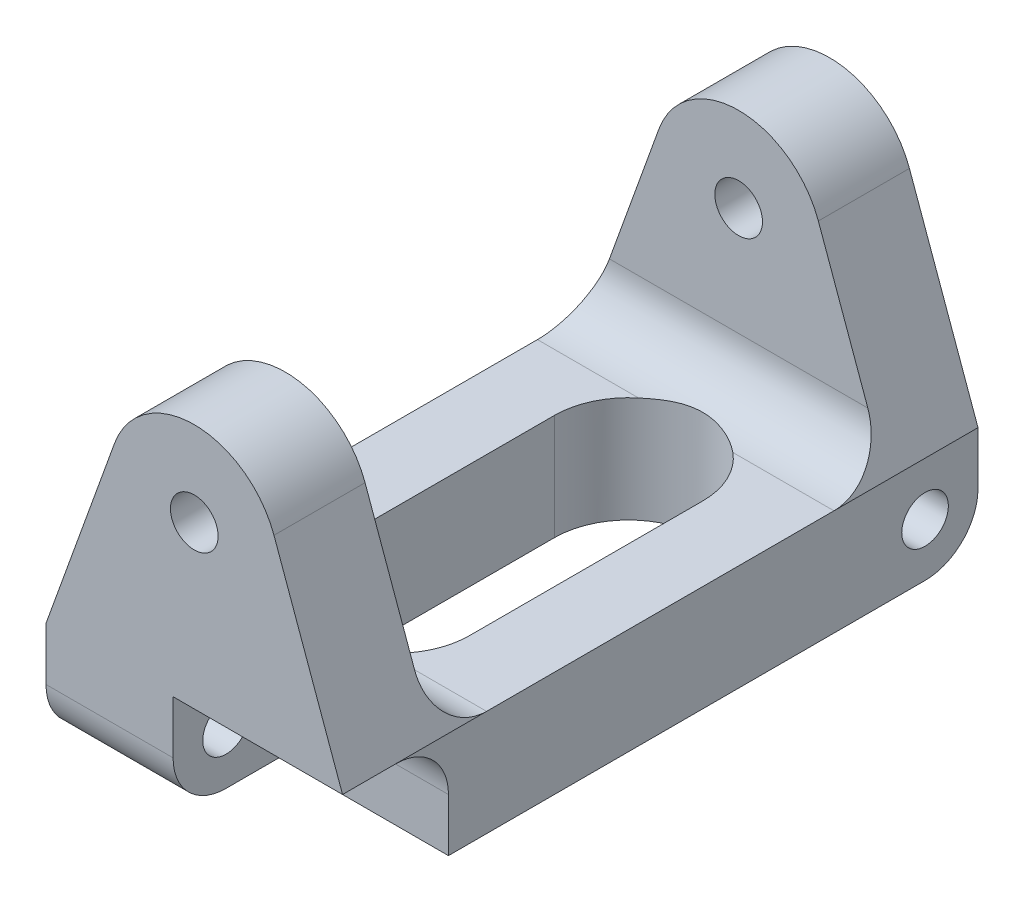
ISO-10303-21;
HEADER;
FILE_DESCRIPTION(('STEP AP214'),'2;1');
FILE_NAME('part.step','',(''),(''),'','','');
FILE_SCHEMA(('AUTOMOTIVE_DESIGN { 1 0 10303 214 1 1 1 1 }'));
ENDSEC;
DATA;
#1=APPLICATION_CONTEXT('core data for automotive mechanical design processes');
#2=APPLICATION_PROTOCOL_DEFINITION('international standard','automotive_design',2000,#1);
#3=PRODUCT_CONTEXT('',#1,'mechanical');
#4=PRODUCT('Part','Part','',(#3));
#5=PRODUCT_RELATED_PRODUCT_CATEGORY('part','',(#4));
#6=PRODUCT_DEFINITION_FORMATION('','',#4);
#7=PRODUCT_DEFINITION_CONTEXT('part definition',#1,'design');
#8=PRODUCT_DEFINITION('design','',#6,#7);
#9=PRODUCT_DEFINITION_SHAPE('','',#8);
#10=(LENGTH_UNIT() NAMED_UNIT(*) SI_UNIT(.MILLI.,.METRE.));
#11=(NAMED_UNIT(*) PLANE_ANGLE_UNIT() SI_UNIT($,.RADIAN.));
#12=(NAMED_UNIT(*) SI_UNIT($,.STERADIAN.) SOLID_ANGLE_UNIT());
#13=UNCERTAINTY_MEASURE_WITH_UNIT(LENGTH_MEASURE(1.E-05),#10,'distance_accuracy_value','');
#14=(GEOMETRIC_REPRESENTATION_CONTEXT(3) GLOBAL_UNCERTAINTY_ASSIGNED_CONTEXT((#13)) GLOBAL_UNIT_ASSIGNED_CONTEXT((#10,
#11,#12)) REPRESENTATION_CONTEXT('',''));
#15=CARTESIAN_POINT('',(0.,0.,0.));
#16=DIRECTION('',(0.,0.,1.));
#17=DIRECTION('',(1.,0.,0.));
#18=AXIS2_PLACEMENT_3D('',#15,#16,#17);
#19=CARTESIAN_POINT('',(10.1112698372208,-2.5,12.5));
#20=DIRECTION('',(-1.,0.,0.));
#21=DIRECTION('',(0.,0.,-1.));
#22=AXIS2_PLACEMENT_3D('',#19,#20,#21);
#23=CYLINDRICAL_SURFACE('',#22,1.1);
#24=CARTESIAN_POINT('',(-7.,-2.5,12.5));
#25=DIRECTION('',(1.,0.,0.));
#26=DIRECTION('',(0.,0.,-1.));
#27=AXIS2_PLACEMENT_3D('',#24,#25,#26);
#28=CIRCLE('',#27,1.1);
#29=CARTESIAN_POINT('',(-7.,-2.5,11.4));
#30=VERTEX_POINT('',#29);
#31=EDGE_CURVE('E370',#30,#30,#28,.T.);
#32=ORIENTED_EDGE('',*,*,#31,.F.);
#33=EDGE_LOOP('',(#32));
#34=FACE_BOUND('',#33,.T.);
#35=CARTESIAN_POINT('',(-0.999999999999996,-2.5,12.5));
#36=DIRECTION('',(1.,0.,0.));
#37=DIRECTION('',(0.,0.,-1.));
#38=AXIS2_PLACEMENT_3D('',#35,#36,#37);
#39=CIRCLE('',#38,1.1);
#40=CARTESIAN_POINT('',(-0.999999999999996,-2.5,11.4));
#41=VERTEX_POINT('',#40);
#42=EDGE_CURVE('E450',#41,#41,#39,.T.);
#43=ORIENTED_EDGE('',*,*,#42,.T.);
#44=EDGE_LOOP('',(#43));
#45=FACE_BOUND('',#44,.T.);
#46=ADVANCED_FACE('F56',(#34,#45),#23,.F.);
#47=CARTESIAN_POINT('',(0.,-2.5,12.5));
#48=DIRECTION('',(1.,0.,0.));
#49=DIRECTION('',(0.,0.,1.));
#50=AXIS2_PLACEMENT_3D('',#47,#48,#49);
#51=CYLINDRICAL_SURFACE('',#50,2.5);
#52=DIRECTION('',(1.,0.,0.));
#53=VECTOR('',#52,1.);
#54=CARTESIAN_POINT('',(0.,-5.,12.5));
#55=LINE('',#54,#53);
#56=CARTESIAN_POINT('',(-7.,-5.,12.5));
#57=VERTEX_POINT('',#56);
#58=CARTESIAN_POINT('',(-0.999999999999996,-5.,12.5));
#59=VERTEX_POINT('',#58);
#60=EDGE_CURVE('E228',#57,#59,#55,.T.);
#61=ORIENTED_EDGE('',*,*,#60,.T.);
#62=CARTESIAN_POINT('',(-0.999999999999996,-2.5,12.5));
#63=DIRECTION('',(1.,0.,0.));
#64=DIRECTION('',(0.,0.,-1.));
#65=AXIS2_PLACEMENT_3D('',#62,#63,#64);
#66=CIRCLE('',#65,2.5);
#67=CARTESIAN_POINT('',(-0.999999999999996,-2.5,15.));
#68=VERTEX_POINT('',#67);
#69=EDGE_CURVE('E213',#68,#59,#66,.T.);
#70=ORIENTED_EDGE('',*,*,#69,.F.);
#71=DIRECTION('',(1.,0.,0.));
#72=VECTOR('',#71,1.);
#73=CARTESIAN_POINT('',(0.,-2.5,15.));
#74=LINE('',#73,#72);
#75=CARTESIAN_POINT('',(-7.,-2.5,15.));
#76=VERTEX_POINT('',#75);
#77=EDGE_CURVE('E236',#68,#76,#74,.F.);
#78=ORIENTED_EDGE('',*,*,#77,.T.);
#79=CARTESIAN_POINT('',(-7.,-2.5,12.5));
#80=DIRECTION('',(-1.,0.,0.));
#81=DIRECTION('',(0.,0.,1.));
#82=AXIS2_PLACEMENT_3D('',#79,#80,#81);
#83=CIRCLE('',#82,2.5);
#84=EDGE_CURVE('E235',#76,#57,#83,.F.);
#85=ORIENTED_EDGE('',*,*,#84,.T.);
#86=EDGE_LOOP('',(#61,#70,#78,#85));
#87=FACE_BOUND('',#86,.T.);
#88=ADVANCED_FACE('F233',(#87),#51,.T.);
#89=CARTESIAN_POINT('',(0.,0.,0.));
#90=DIRECTION('',(0.,1.,0.));
#91=DIRECTION('',(0.,0.,1.));
#92=AXIS2_PLACEMENT_3D('',#89,#90,#91);
#93=PLANE('',#92);
#94=DIRECTION('',(0.,0.,1.));
#95=VECTOR('',#94,1.);
#96=CARTESIAN_POINT('',(-3.5,0.,5.5));
#97=LINE('',#96,#95);
#98=CARTESIAN_POINT('',(-3.5,0.,-5.5));
#99=VERTEX_POINT('',#98);
#100=CARTESIAN_POINT('',(-3.5,0.,5.5));
#101=VERTEX_POINT('',#100);
#102=EDGE_CURVE('E583',#99,#101,#97,.T.);
#103=ORIENTED_EDGE('',*,*,#102,.F.);
#104=CARTESIAN_POINT('',(0.,0.,-5.5));
#105=DIRECTION('',(0.,1.,0.));
#106=DIRECTION('',(0.,0.,1.));
#107=AXIS2_PLACEMENT_3D('',#104,#105,#106);
#108=CIRCLE('',#107,3.5);
#109=CARTESIAN_POINT('',(-2.22710574513201,0.,-8.2));
#110=VERTEX_POINT('',#109);
#111=EDGE_CURVE('E582',#110,#99,#108,.T.);
#112=ORIENTED_EDGE('',*,*,#111,.F.);
#113=DIRECTION('',(-1.,0.,0.));
#114=VECTOR('',#113,1.);
#115=CARTESIAN_POINT('',(-7.,0.,-8.2));
#116=LINE('',#115,#114);
#117=CARTESIAN_POINT('',(-7.,0.,-8.19999999999998));
#118=VERTEX_POINT('',#117);
#119=EDGE_CURVE('E497',#110,#118,#116,.T.);
#120=ORIENTED_EDGE('',*,*,#119,.T.);
#121=DIRECTION('',(0.,0.,-1.));
#122=VECTOR('',#121,1.);
#123=CARTESIAN_POINT('',(-7.,0.,0.));
#124=LINE('',#123,#122);
#125=CARTESIAN_POINT('',(-7.,0.,8.19999999999998));
#126=VERTEX_POINT('',#125);
#127=EDGE_CURVE('E482',#126,#118,#124,.T.);
#128=ORIENTED_EDGE('',*,*,#127,.F.);
#129=DIRECTION('',(-1.,0.,0.));
#130=VECTOR('',#129,1.);
#131=CARTESIAN_POINT('',(-7.,0.,8.2));
#132=LINE('',#131,#130);
#133=CARTESIAN_POINT('',(-2.22710574513201,0.,8.2));
#134=VERTEX_POINT('',#133);
#135=EDGE_CURVE('E360',#134,#126,#132,.T.);
#136=ORIENTED_EDGE('',*,*,#135,.F.);
#137=CARTESIAN_POINT('',(0.,0.,5.5));
#138=DIRECTION('',(0.,-1.,0.));
#139=DIRECTION('',(0.,0.,-1.));
#140=AXIS2_PLACEMENT_3D('',#137,#138,#139);
#141=CIRCLE('',#140,3.5);
#142=EDGE_CURVE('E419',#134,#101,#141,.T.);
#143=ORIENTED_EDGE('',*,*,#142,.T.);
#144=EDGE_LOOP('',(#103,#112,#120,#128,#136,#143));
#145=FACE_BOUND('',#144,.T.);
#146=ADVANCED_FACE('F310',(#145),#93,.T.);
#147=CARTESIAN_POINT('',(3.5,0.,-5.5));
#148=VERTEX_POINT('',#147);
#149=CARTESIAN_POINT('',(2.22710574513201,0.,-8.2));
#150=VERTEX_POINT('',#149);
#151=EDGE_CURVE('E79',#148,#150,#108,.T.);
#152=ORIENTED_EDGE('',*,*,#151,.F.);
#153=DIRECTION('',(0.,0.,-1.));
#154=VECTOR('',#153,1.);
#155=CARTESIAN_POINT('',(3.5,0.,5.5));
#156=LINE('',#155,#154);
#157=CARTESIAN_POINT('',(3.5,0.,5.5));
#158=VERTEX_POINT('',#157);
#159=EDGE_CURVE('E258',#158,#148,#156,.T.);
#160=ORIENTED_EDGE('',*,*,#159,.F.);
#161=CARTESIAN_POINT('',(2.22710574513201,0.,8.2));
#162=VERTEX_POINT('',#161);
#163=EDGE_CURVE('E414',#158,#162,#141,.T.);
#164=ORIENTED_EDGE('',*,*,#163,.T.);
#165=CARTESIAN_POINT('',(7.,0.,8.2));
#166=VERTEX_POINT('',#165);
#167=EDGE_CURVE('E241',#166,#162,#132,.T.);
#168=ORIENTED_EDGE('',*,*,#167,.F.);
#169=DIRECTION('',(0.,0.,-1.));
#170=VECTOR('',#169,1.);
#171=CARTESIAN_POINT('',(7.,0.,0.));
#172=LINE('',#171,#170);
#173=CARTESIAN_POINT('',(7.,0.,-8.2));
#174=VERTEX_POINT('',#173);
#175=EDGE_CURVE('E487',#166,#174,#172,.T.);
#176=ORIENTED_EDGE('',*,*,#175,.T.);
#177=EDGE_CURVE('E499',#174,#150,#116,.T.);
#178=ORIENTED_EDGE('',*,*,#177,.T.);
#179=EDGE_LOOP('',(#152,#160,#164,#168,#176,#178));
#180=FACE_BOUND('',#179,.T.);
#181=ADVANCED_FACE('F306',(#180),#93,.T.);
#182=CARTESIAN_POINT('',(-7.,-5.,0.));
#183=DIRECTION('',(1.,0.,0.));
#184=DIRECTION('',(0.,0.,-1.));
#185=AXIS2_PLACEMENT_3D('',#182,#183,#184);
#186=PLANE('',#185);
#187=CARTESIAN_POINT('',(-7.,-2.5,-12.5));
#188=DIRECTION('',(-1.,0.,0.));
#189=DIRECTION('',(0.,0.,1.));
#190=AXIS2_PLACEMENT_3D('',#187,#188,#189);
#191=CIRCLE('',#190,1.1);
#192=CARTESIAN_POINT('',(-7.,-2.5,-11.4));
#193=VERTEX_POINT('',#192);
#194=EDGE_CURVE('E567',#193,#193,#191,.T.);
#195=ORIENTED_EDGE('',*,*,#194,.F.);
#196=EDGE_LOOP('',(#195));
#197=FACE_BOUND('',#196,.T.);
#198=DIRECTION('',(0.,1.,0.));
#199=VECTOR('',#198,1.);
#200=CARTESIAN_POINT('',(-7.,-5.,-15.));
#201=LINE('',#200,#199);
#202=CARTESIAN_POINT('',(-7.,-2.5,-15.));
#203=VERTEX_POINT('',#202);
#204=CARTESIAN_POINT('',(-7.,0.,-15.));
#205=VERTEX_POINT('',#204);
#206=EDGE_CURVE('E495',#203,#205,#201,.T.);
#207=ORIENTED_EDGE('',*,*,#206,.F.);
#208=CARTESIAN_POINT('',(-7.,-2.5,-12.5));
#209=DIRECTION('',(1.,0.,0.));
#210=DIRECTION('',(0.,0.,-1.));
#211=AXIS2_PLACEMENT_3D('',#208,#209,#210);
#212=CIRCLE('',#211,2.5);
#213=CARTESIAN_POINT('',(-7.,-5.,-12.5));
#214=VERTEX_POINT('',#213);
#215=EDGE_CURVE('E509',#203,#214,#212,.F.);
#216=ORIENTED_EDGE('',*,*,#215,.T.);
#217=DIRECTION('',(0.,0.,-1.));
#218=VECTOR('',#217,1.);
#219=CARTESIAN_POINT('',(-7.,-5.,0.));
#220=LINE('',#219,#218);
#221=EDGE_CURVE('E481',#57,#214,#220,.T.);
#222=ORIENTED_EDGE('',*,*,#221,.F.);
#223=ORIENTED_EDGE('',*,*,#84,.F.);
#224=DIRECTION('',(0.,1.,0.));
#225=VECTOR('',#224,1.);
#226=CARTESIAN_POINT('',(-7.,-5.,15.));
#227=LINE('',#226,#225);
#228=CARTESIAN_POINT('',(-7.,0.,15.));
#229=VERTEX_POINT('',#228);
#230=EDGE_CURVE('E368',#76,#229,#227,.T.);
#231=ORIENTED_EDGE('',*,*,#230,.T.);
#232=DIRECTION('',(0.,0.,1.));
#233=VECTOR('',#232,1.);
#234=CARTESIAN_POINT('',(-7.,0.,-7.49726971278934));
#235=LINE('',#234,#233);
#236=EDGE_CURVE('E375',#126,#229,#235,.T.);
#237=ORIENTED_EDGE('',*,*,#236,.F.);
#238=ORIENTED_EDGE('',*,*,#127,.T.);
#239=DIRECTION('',(0.,0.,-1.));
#240=VECTOR('',#239,1.);
#241=CARTESIAN_POINT('',(-7.,0.,7.49726971278934));
#242=LINE('',#241,#240);
#243=EDGE_CURVE('E563',#118,#205,#242,.T.);
#244=ORIENTED_EDGE('',*,*,#243,.T.);
#245=EDGE_LOOP('',(#207,#216,#222,#223,#231,#237,#238,#244));
#246=FACE_BOUND('',#245,.T.);
#247=ORIENTED_EDGE('',*,*,#31,.T.);
#248=EDGE_LOOP('',(#247));
#249=FACE_BOUND('',#248,.T.);
#250=ADVANCED_FACE('F309',(#197,#246,#249),#186,.F.);
#251=CARTESIAN_POINT('',(0.,-5.,-15.));
#252=DIRECTION('',(0.,0.,1.));
#253=DIRECTION('',(1.,0.,0.));
#254=AXIS2_PLACEMENT_3D('',#251,#252,#253);
#255=PLANE('',#254);
#256=CARTESIAN_POINT('',(0.,7.625,-15.));
#257=DIRECTION('',(0.,0.,-1.));
#258=DIRECTION('',(-1.,0.,0.));
#259=AXIS2_PLACEMENT_3D('',#256,#257,#258);
#260=CIRCLE('',#259,1.125);
#261=CARTESIAN_POINT('',(-1.125,7.625,-15.));
#262=VERTEX_POINT('',#261);
#263=EDGE_CURVE('E594',#262,#262,#260,.T.);
#264=ORIENTED_EDGE('',*,*,#263,.F.);
#265=EDGE_LOOP('',(#264));
#266=FACE_BOUND('',#265,.T.);
#267=DIRECTION('',(0.,1.,0.));
#268=VECTOR('',#267,1.);
#269=CARTESIAN_POINT('',(7.,-5.,-15.));
#270=LINE('',#269,#268);
#271=CARTESIAN_POINT('',(7.,-2.5,-15.));
#272=VERTEX_POINT('',#271);
#273=CARTESIAN_POINT('',(7.,0.,-15.));
#274=VERTEX_POINT('',#273);
#275=EDGE_CURVE('E484',#272,#274,#270,.T.);
#276=ORIENTED_EDGE('',*,*,#275,.F.);
#277=DIRECTION('',(1.,0.,0.));
#278=VECTOR('',#277,1.);
#279=CARTESIAN_POINT('',(0.,-2.5,-15.));
#280=LINE('',#279,#278);
#281=EDGE_CURVE('E507',#272,#203,#280,.F.);
#282=ORIENTED_EDGE('',*,*,#281,.T.);
#283=ORIENTED_EDGE('',*,*,#206,.T.);
#284=DIRECTION('',(0.339062045334858,0.940764013668328,0.));
#285=VECTOR('',#284,1.);
#286=CARTESIAN_POINT('',(-7.,0.,-15.));
#287=LINE('',#286,#285);
#288=CARTESIAN_POINT('',(-3.76305605467331,8.98124818133944,-15.));
#289=VERTEX_POINT('',#288);
#290=EDGE_CURVE('E550',#205,#289,#287,.T.);
#291=ORIENTED_EDGE('',*,*,#290,.T.);
#292=CARTESIAN_POINT('',(0.,7.625,-15.));
#293=DIRECTION('',(0.,0.,-1.));
#294=DIRECTION('',(-1.,0.,0.));
#295=AXIS2_PLACEMENT_3D('',#292,#293,#294);
#296=CIRCLE('',#295,4.);
#297=CARTESIAN_POINT('',(3.76305605467331,8.98124818133944,-15.));
#298=VERTEX_POINT('',#297);
#299=EDGE_CURVE('E545',#289,#298,#296,.T.);
#300=ORIENTED_EDGE('',*,*,#299,.T.);
#301=DIRECTION('',(0.339062045334859,-0.940764013668328,0.));
#302=VECTOR('',#301,1.);
#303=CARTESIAN_POINT('',(7.,0.,-15.));
#304=LINE('',#303,#302);
#305=EDGE_CURVE('E542',#298,#274,#304,.T.);
#306=ORIENTED_EDGE('',*,*,#305,.T.);
#307=EDGE_LOOP('',(#276,#282,#283,#291,#300,#306));
#308=FACE_BOUND('',#307,.T.);
#309=ADVANCED_FACE('F314',(#266,#308),#255,.F.);
#310=CARTESIAN_POINT('',(7.,-5.,0.));
#311=DIRECTION('',(1.,0.,0.));
#312=DIRECTION('',(0.,0.,-1.));
#313=AXIS2_PLACEMENT_3D('',#310,#311,#312);
#314=PLANE('',#313);
#315=CARTESIAN_POINT('',(7.,-2.5,12.5));
#316=DIRECTION('',(1.,0.,0.));
#317=DIRECTION('',(0.,0.,-1.));
#318=AXIS2_PLACEMENT_3D('',#315,#316,#317);
#319=CIRCLE('',#318,2.5);
#320=CARTESIAN_POINT('',(7.,-2.5,10.));
#321=VERTEX_POINT('',#320);
#322=CARTESIAN_POINT('',(7.,0.,12.5));
#323=VERTEX_POINT('',#322);
#324=EDGE_CURVE('E454',#321,#323,#319,.T.);
#325=ORIENTED_EDGE('',*,*,#324,.F.);
#326=DIRECTION('',(0.,1.,0.));
#327=VECTOR('',#326,1.);
#328=CARTESIAN_POINT('',(7.,-5.,10.));
#329=LINE('',#328,#327);
#330=CARTESIAN_POINT('',(7.,-5.,10.));
#331=VERTEX_POINT('',#330);
#332=EDGE_CURVE('E451',#331,#321,#329,.T.);
#333=ORIENTED_EDGE('',*,*,#332,.F.);
#334=DIRECTION('',(0.,0.,-1.));
#335=VECTOR('',#334,1.);
#336=CARTESIAN_POINT('',(7.,-5.,0.));
#337=LINE('',#336,#335);
#338=CARTESIAN_POINT('',(7.,-5.,-12.5));
#339=VERTEX_POINT('',#338);
#340=EDGE_CURVE('E476',#331,#339,#337,.T.);
#341=ORIENTED_EDGE('',*,*,#340,.T.);
#342=CARTESIAN_POINT('',(7.,-2.5,-12.5));
#343=DIRECTION('',(1.,0.,0.));
#344=DIRECTION('',(0.,0.,-1.));
#345=AXIS2_PLACEMENT_3D('',#342,#343,#344);
#346=CIRCLE('',#345,2.5);
#347=EDGE_CURVE('E505',#339,#272,#346,.T.);
#348=ORIENTED_EDGE('',*,*,#347,.T.);
#349=ORIENTED_EDGE('',*,*,#275,.T.);
#350=DIRECTION('',(0.,0.,-1.));
#351=VECTOR('',#350,1.);
#352=CARTESIAN_POINT('',(7.,0.,7.49726971278934));
#353=LINE('',#352,#351);
#354=EDGE_CURVE('E519',#174,#274,#353,.T.);
#355=ORIENTED_EDGE('',*,*,#354,.F.);
#356=ORIENTED_EDGE('',*,*,#175,.F.);
#357=DIRECTION('',(0.,0.,1.));
#358=VECTOR('',#357,1.);
#359=CARTESIAN_POINT('',(7.,0.,-7.49726971278934));
#360=LINE('',#359,#358);
#361=EDGE_CURVE('E378',#166,#323,#360,.T.);
#362=ORIENTED_EDGE('',*,*,#361,.T.);
#363=EDGE_LOOP('',(#325,#333,#341,#348,#349,#355,#356,#362));
#364=FACE_BOUND('',#363,.T.);
#365=CARTESIAN_POINT('',(7.,-2.5,-12.5));
#366=DIRECTION('',(1.,0.,0.));
#367=DIRECTION('',(0.,0.,-1.));
#368=AXIS2_PLACEMENT_3D('',#365,#366,#367);
#369=CIRCLE('',#368,1.1);
#370=CARTESIAN_POINT('',(7.,-2.5,-13.6));
#371=VERTEX_POINT('',#370);
#372=EDGE_CURVE('E490',#371,#371,#369,.F.);
#373=ORIENTED_EDGE('',*,*,#372,.T.);
#374=EDGE_LOOP('',(#373));
#375=FACE_BOUND('',#374,.T.);
#376=ADVANCED_FACE('F304',(#364,#375),#314,.T.);
#377=CARTESIAN_POINT('',(0.,-5.,0.));
#378=DIRECTION('',(0.,1.,0.));
#379=DIRECTION('',(0.,0.,1.));
#380=AXIS2_PLACEMENT_3D('',#377,#378,#379);
#381=PLANE('',#380);
#382=DIRECTION('',(0.,0.,1.));
#383=VECTOR('',#382,1.);
#384=CARTESIAN_POINT('',(-3.5,-5.,0.));
#385=LINE('',#384,#383);
#386=CARTESIAN_POINT('',(-3.5,-5.,-5.5));
#387=VERTEX_POINT('',#386);
#388=CARTESIAN_POINT('',(-3.5,-5.,5.5));
#389=VERTEX_POINT('',#388);
#390=EDGE_CURVE('E12',#387,#389,#385,.T.);
#391=ORIENTED_EDGE('',*,*,#390,.T.);
#392=CARTESIAN_POINT('',(0.,-5.,5.5));
#393=DIRECTION('',(0.,-1.,0.));
#394=DIRECTION('',(0.,0.,-1.));
#395=AXIS2_PLACEMENT_3D('',#392,#393,#394);
#396=CIRCLE('',#395,3.5);
#397=CARTESIAN_POINT('',(3.5,-5.,5.5));
#398=VERTEX_POINT('',#397);
#399=EDGE_CURVE('E409',#389,#398,#396,.F.);
#400=ORIENTED_EDGE('',*,*,#399,.T.);
#401=DIRECTION('',(0.,0.,1.));
#402=VECTOR('',#401,1.);
#403=CARTESIAN_POINT('',(3.5,-5.,5.5));
#404=LINE('',#403,#402);
#405=CARTESIAN_POINT('',(3.5,-5.,-5.5));
#406=VERTEX_POINT('',#405);
#407=EDGE_CURVE('E593',#406,#398,#404,.T.);
#408=ORIENTED_EDGE('',*,*,#407,.F.);
#409=CARTESIAN_POINT('',(0.,-5.,-5.5));
#410=DIRECTION('',(0.,1.,0.));
#411=DIRECTION('',(0.,0.,1.));
#412=AXIS2_PLACEMENT_3D('',#409,#410,#411);
#413=CIRCLE('',#412,3.5);
#414=EDGE_CURVE('E259',#387,#406,#413,.F.);
#415=ORIENTED_EDGE('',*,*,#414,.F.);
#416=EDGE_LOOP('',(#391,#400,#408,#415));
#417=FACE_BOUND('',#416,.T.);
#418=ORIENTED_EDGE('',*,*,#340,.F.);
#419=DIRECTION('',(1.,0.,0.));
#420=VECTOR('',#419,1.);
#421=CARTESIAN_POINT('',(-0.999999999999996,-5.,10.));
#422=LINE('',#421,#420);
#423=CARTESIAN_POINT('',(-0.999999999999996,-5.,10.));
#424=VERTEX_POINT('',#423);
#425=EDGE_CURVE('E230',#424,#331,#422,.T.);
#426=ORIENTED_EDGE('',*,*,#425,.F.);
#427=DIRECTION('',(0.,0.,-1.));
#428=VECTOR('',#427,1.);
#429=CARTESIAN_POINT('',(-0.999999999999996,-5.,0.));
#430=LINE('',#429,#428);
#431=EDGE_CURVE('E217',#59,#424,#430,.T.);
#432=ORIENTED_EDGE('',*,*,#431,.F.);
#433=ORIENTED_EDGE('',*,*,#60,.F.);
#434=ORIENTED_EDGE('',*,*,#221,.T.);
#435=DIRECTION('',(1.,0.,0.));
#436=VECTOR('',#435,1.);
#437=CARTESIAN_POINT('',(0.,-5.,-12.5));
#438=LINE('',#437,#436);
#439=EDGE_CURVE('E480',#214,#339,#438,.T.);
#440=ORIENTED_EDGE('',*,*,#439,.T.);
#441=EDGE_LOOP('',(#418,#426,#432,#433,#434,#440));
#442=FACE_BOUND('',#441,.T.);
#443=ADVANCED_FACE('F226',(#417,#442),#381,.F.);
#444=CARTESIAN_POINT('',(10.1112698372208,-2.5,-12.5));
#445=DIRECTION('',(-1.,0.,0.));
#446=DIRECTION('',(0.,0.,1.));
#447=AXIS2_PLACEMENT_3D('',#444,#445,#446);
#448=CYLINDRICAL_SURFACE('',#447,1.1);
#449=ORIENTED_EDGE('',*,*,#194,.T.);
#450=EDGE_LOOP('',(#449));
#451=FACE_BOUND('',#450,.T.);
#452=ORIENTED_EDGE('',*,*,#372,.F.);
#453=EDGE_LOOP('',(#452));
#454=FACE_BOUND('',#453,.T.);
#455=ADVANCED_FACE('F297',(#451,#454),#448,.F.);
#456=CARTESIAN_POINT('',(0.,0.,-10.7));
#457=DIRECTION('',(0.,0.,1.));
#458=DIRECTION('',(1.,0.,0.));
#459=AXIS2_PLACEMENT_3D('',#456,#457,#458);
#460=PLANE('',#459);
#461=CARTESIAN_POINT('',(0.,7.625,-10.7));
#462=DIRECTION('',(0.,0.,1.));
#463=DIRECTION('',(1.,0.,0.));
#464=AXIS2_PLACEMENT_3D('',#461,#462,#463);
#465=CIRCLE('',#464,1.125);
#466=CARTESIAN_POINT('',(1.125,7.625,-10.7));
#467=VERTEX_POINT('',#466);
#468=EDGE_CURVE('E553',#467,#467,#465,.F.);
#469=ORIENTED_EDGE('',*,*,#468,.T.);
#470=EDGE_LOOP('',(#469));
#471=FACE_BOUND('',#470,.T.);
#472=DIRECTION('',(0.339062045334858,0.940764013668328,0.));
#473=VECTOR('',#472,1.);
#474=CARTESIAN_POINT('',(-7.,0.,-10.7));
#475=LINE('',#474,#473);
#476=CARTESIAN_POINT('',(-6.09897157945925,2.5,-10.7));
#477=VERTEX_POINT('',#476);
#478=CARTESIAN_POINT('',(-3.76305605467331,8.98124818133944,-10.7));
#479=VERTEX_POINT('',#478);
#480=EDGE_CURVE('E546',#477,#479,#475,.T.);
#481=ORIENTED_EDGE('',*,*,#480,.F.);
#482=DIRECTION('',(-1.,0.,0.));
#483=VECTOR('',#482,1.);
#484=CARTESIAN_POINT('',(7.,2.5,-10.7));
#485=LINE('',#484,#483);
#486=CARTESIAN_POINT('',(6.09897157945926,2.5,-10.7));
#487=VERTEX_POINT('',#486);
#488=EDGE_CURVE('E502',#477,#487,#485,.F.);
#489=ORIENTED_EDGE('',*,*,#488,.T.);
#490=DIRECTION('',(0.339062045334859,-0.940764013668328,0.));
#491=VECTOR('',#490,1.);
#492=CARTESIAN_POINT('',(7.,0.,-10.7));
#493=LINE('',#492,#491);
#494=CARTESIAN_POINT('',(3.76305605467331,8.98124818133944,-10.7));
#495=VERTEX_POINT('',#494);
#496=EDGE_CURVE('E521',#495,#487,#493,.T.);
#497=ORIENTED_EDGE('',*,*,#496,.F.);
#498=CARTESIAN_POINT('',(0.,7.625,-10.7));
#499=DIRECTION('',(0.,0.,1.));
#500=DIRECTION('',(1.,0.,0.));
#501=AXIS2_PLACEMENT_3D('',#498,#499,#500);
#502=CIRCLE('',#501,4.);
#503=EDGE_CURVE('E559',#479,#495,#502,.F.);
#504=ORIENTED_EDGE('',*,*,#503,.F.);
#505=EDGE_LOOP('',(#481,#489,#497,#504));
#506=FACE_BOUND('',#505,.T.);
#507=ADVANCED_FACE('F293',(#471,#506),#460,.T.);
#508=CARTESIAN_POINT('',(-7.,0.,7.49726971278934));
#509=DIRECTION('',(-0.940764013668328,0.339062045334858,0.));
#510=DIRECTION('',(-0.339062045334858,-0.940764013668328,0.));
#511=AXIS2_PLACEMENT_3D('',#508,#509,#510);
#512=PLANE('',#511);
#513=ORIENTED_EDGE('',*,*,#243,.F.);
#514=CARTESIAN_POINT('',(-6.09897157945925,2.5,-8.2));
#515=DIRECTION('',(-0.940764013668328,0.339062045334858,0.));
#516=DIRECTION('',(0.339062045334858,0.940764013668328,0.));
#517=AXIS2_PLACEMENT_3D('',#514,#515,#516);
#518=ELLIPSE('',#517,2.6574145733442,2.5);
#519=EDGE_CURVE('E511',#118,#477,#518,.F.);
#520=ORIENTED_EDGE('',*,*,#519,.T.);
#521=ORIENTED_EDGE('',*,*,#480,.T.);
#522=DIRECTION('',(0.,0.,-1.));
#523=VECTOR('',#522,1.);
#524=CARTESIAN_POINT('',(-3.76305605467331,8.98124818133944,7.49726971278934));
#525=LINE('',#524,#523);
#526=EDGE_CURVE('E548',#479,#289,#525,.T.);
#527=ORIENTED_EDGE('',*,*,#526,.T.);
#528=ORIENTED_EDGE('',*,*,#290,.F.);
#529=EDGE_LOOP('',(#513,#520,#521,#527,#528));
#530=FACE_BOUND('',#529,.T.);
#531=ADVANCED_FACE('F289',(#530),#512,.T.);
#532=CARTESIAN_POINT('',(0.,7.625,7.49726971278934));
#533=DIRECTION('',(0.,0.,-1.));
#534=DIRECTION('',(-1.,0.,0.));
#535=AXIS2_PLACEMENT_3D('',#532,#533,#534);
#536=CYLINDRICAL_SURFACE('',#535,4.);
#537=ORIENTED_EDGE('',*,*,#526,.F.);
#538=ORIENTED_EDGE('',*,*,#503,.T.);
#539=DIRECTION('',(0.,0.,-1.));
#540=VECTOR('',#539,1.);
#541=CARTESIAN_POINT('',(3.76305605467331,8.98124818133944,7.49726971278934));
#542=LINE('',#541,#540);
#543=EDGE_CURVE('E558',#495,#298,#542,.T.);
#544=ORIENTED_EDGE('',*,*,#543,.T.);
#545=ORIENTED_EDGE('',*,*,#299,.F.);
#546=EDGE_LOOP('',(#537,#538,#544,#545));
#547=FACE_BOUND('',#546,.T.);
#548=ADVANCED_FACE('F285',(#547),#536,.T.);
#549=CARTESIAN_POINT('',(7.,0.,7.49726971278934));
#550=DIRECTION('',(0.940764013668328,0.339062045334859,0.));
#551=DIRECTION('',(-0.339062045334859,0.940764013668328,0.));
#552=AXIS2_PLACEMENT_3D('',#549,#550,#551);
#553=PLANE('',#552);
#554=ORIENTED_EDGE('',*,*,#543,.F.);
#555=ORIENTED_EDGE('',*,*,#496,.T.);
#556=CARTESIAN_POINT('',(6.09897157945926,2.5,-8.2));
#557=DIRECTION('',(0.940764013668328,0.339062045334859,0.));
#558=DIRECTION('',(0.339062045334859,-0.940764013668328,0.));
#559=AXIS2_PLACEMENT_3D('',#556,#557,#558);
#560=ELLIPSE('',#559,2.6574145733442,2.5);
#561=EDGE_CURVE('E64',#487,#174,#560,.F.);
#562=ORIENTED_EDGE('',*,*,#561,.T.);
#563=ORIENTED_EDGE('',*,*,#354,.T.);
#564=ORIENTED_EDGE('',*,*,#305,.F.);
#565=EDGE_LOOP('',(#554,#555,#562,#563,#564));
#566=FACE_BOUND('',#565,.T.);
#567=ADVANCED_FACE('F281',(#566),#553,.T.);
#568=CARTESIAN_POINT('',(0.,7.625,-7.51801948466054));
#569=DIRECTION('',(0.,0.,-1.));
#570=DIRECTION('',(-1.,0.,0.));
#571=AXIS2_PLACEMENT_3D('',#568,#569,#570);
#572=CYLINDRICAL_SURFACE('',#571,1.125);
#573=ORIENTED_EDGE('',*,*,#263,.T.);
#574=EDGE_LOOP('',(#573));
#575=FACE_BOUND('',#574,.T.);
#576=ORIENTED_EDGE('',*,*,#468,.F.);
#577=EDGE_LOOP('',(#576));
#578=FACE_BOUND('',#577,.T.);
#579=ADVANCED_FACE('F277',(#575,#578),#572,.F.);
#580=CARTESIAN_POINT('',(0.,2.5,-8.2));
#581=DIRECTION('',(1.,0.,0.));
#582=DIRECTION('',(0.,0.,-1.));
#583=AXIS2_PLACEMENT_3D('',#580,#581,#582);
#584=CYLINDRICAL_SURFACE('',#583,2.5);
#585=ORIENTED_EDGE('',*,*,#119,.F.);
#586=CARTESIAN_POINT('',(-2.22710574513203,0.,-8.19999999999998));
#587=CARTESIAN_POINT('',(-2.14472873409994,2.17248012795122E-05,-8.26796951492385));
#588=CARTESIAN_POINT('',(-2.05928060457079,0.00277114986269859,-8.33209606816453));
#589=CARTESIAN_POINT('',(-1.88308781622532,0.0120167440778355,-8.4521697699696));
#590=CARTESIAN_POINT('',(-1.79234705635556,0.0185101856758199,-8.50812283585367));
#591=CARTESIAN_POINT('',(-1.60620722442231,0.0335470444907468,-8.61150369140827));
#592=CARTESIAN_POINT('',(-1.51080395531602,0.042092336834342,-8.65892361313589));
#593=CARTESIAN_POINT('',(-1.31610651331225,0.0597041483468459,-8.74487035621686));
#594=CARTESIAN_POINT('',(-1.21681204668044,0.0687707068887321,-8.78339650468862));
#595=CARTESIAN_POINT('',(-1.02536061507345,0.0851828721368716,-8.84780091174308));
#596=CARTESIAN_POINT('',(-0.933508697764408,0.0926096873258149,-8.87456843386554));
#597=CARTESIAN_POINT('',(-0.747820876159442,0.105958446407206,-8.92051293903721));
#598=CARTESIAN_POINT('',(-0.653985171307719,0.111880540807858,-8.93969068135368));
#599=CARTESIAN_POINT('',(-0.465151387521365,0.121566846462805,-8.97026832052391));
#600=CARTESIAN_POINT('',(-0.370156278177597,0.125335719738407,-8.98168503134565));
#601=CARTESIAN_POINT('',(-0.179479524175504,0.130331765988633,-8.99670306940935));
#602=CARTESIAN_POINT('',(-0.0837978696703044,0.131558902434612,-9.0003042843307));
#603=CARTESIAN_POINT('',(0.107434369522413,0.131339906349205,-8.99965581026899));
#604=CARTESIAN_POINT('',(0.20298498583364,0.12989659872414,-8.99541441752406));
#605=CARTESIAN_POINT('',(0.393344301934386,0.124496755198824,-8.97913871371953));
#606=CARTESIAN_POINT('',(0.488153011211726,0.120540251491732,-8.96710450248316));
#607=CARTESIAN_POINT('',(0.6765604881326,0.110526398969544,-8.93531844225375));
#608=CARTESIAN_POINT('',(0.770156235078786,0.104464576030045,-8.91555014574215));
#609=CARTESIAN_POINT('',(0.955321722473723,0.090899146409633,-8.86845500007253));
#610=CARTESIAN_POINT('',(1.04689127616429,0.0833954074367205,-8.84112745727238));
#611=CARTESIAN_POINT('',(1.23605783000467,0.0670407083369384,-8.77613979515736));
#612=CARTESIAN_POINT('',(1.33339728136705,0.0581295100074885,-8.73774302837563));
#613=CARTESIAN_POINT('',(1.52428250607473,0.0408851465726569,-8.65237952380868));
#614=CARTESIAN_POINT('',(1.61782864364416,0.0325519259165145,-8.60541361120341));
#615=CARTESIAN_POINT('',(1.80037970534706,0.0179242052890914,-8.50325659748575));
#616=CARTESIAN_POINT('',(1.88938919145012,0.011627621824126,-8.44807398707306));
#617=CARTESIAN_POINT('',(2.0622918519879,0.00267425509937264,-8.32983367745119));
#618=CARTESIAN_POINT('',(2.14618123987968,2.01351719946812E-05,-8.2667702525907));
#619=CARTESIAN_POINT('',(2.22710574513203,0.,-8.19999999999999));
#620=B_SPLINE_CURVE_WITH_KNOTS('',3,(#586,#587,#588,#589,#590,#591,#592,#593,#594,#595,#596,
#597,#598,#599,#600,#601,#602,#603,#604,#605,#606,#607,#608,#609,#610,#611,#612,#613,#614,#615,
#616,#617,#618,#619),.UNSPECIFIED.,.F.,.F.,(4,2,2,2,2,2,2,2,2,2,2,2,2,2,2,2,4),(0.,
0.320141208402113,0.640049484691488,0.960251236050945,1.28047720517466,1.56803980313178,
1.8555736265925,2.1424825170179,2.42939553073428,2.71600520949574,3.00261121696207,
3.2898300709925,3.57707528918919,3.89170305762746,4.20630054444402,4.52057517044836,
4.83507946866049),.UNSPECIFIED.);
#621=EDGE_CURVE('E251',#110,#150,#620,.T.);
#622=ORIENTED_EDGE('',*,*,#621,.T.);
#623=ORIENTED_EDGE('',*,*,#177,.F.);
#624=ORIENTED_EDGE('',*,*,#561,.F.);
#625=ORIENTED_EDGE('',*,*,#488,.F.);
#626=ORIENTED_EDGE('',*,*,#519,.F.);
#627=EDGE_LOOP('',(#585,#622,#623,#624,#625,#626));
#628=FACE_BOUND('',#627,.T.);
#629=ADVANCED_FACE('F280',(#628),#584,.F.);
#630=CARTESIAN_POINT('',(0.,-2.5,-12.5));
#631=DIRECTION('',(1.,0.,0.));
#632=DIRECTION('',(0.,0.,-1.));
#633=AXIS2_PLACEMENT_3D('',#630,#631,#632);
#634=CYLINDRICAL_SURFACE('',#633,2.5);
#635=ORIENTED_EDGE('',*,*,#215,.F.);
#636=ORIENTED_EDGE('',*,*,#281,.F.);
#637=ORIENTED_EDGE('',*,*,#347,.F.);
#638=ORIENTED_EDGE('',*,*,#439,.F.);
#639=EDGE_LOOP('',(#635,#636,#637,#638));
#640=FACE_BOUND('',#639,.T.);
#641=ADVANCED_FACE('F58',(#640),#634,.T.);
#642=CARTESIAN_POINT('',(-3.5,-24.313207915828,5.5));
#643=DIRECTION('',(-1.,0.,0.));
#644=DIRECTION('',(0.,0.,1.));
#645=AXIS2_PLACEMENT_3D('',#642,#643,#644);
#646=PLANE('',#645);
#647=ORIENTED_EDGE('',*,*,#102,.T.);
#648=DIRECTION('',(0.,1.,0.));
#649=VECTOR('',#648,1.);
#650=CARTESIAN_POINT('',(-3.5,-24.313207915828,5.5));
#651=LINE('',#650,#649);
#652=EDGE_CURVE('E413',#389,#101,#651,.T.);
#653=ORIENTED_EDGE('',*,*,#652,.F.);
#654=ORIENTED_EDGE('',*,*,#390,.F.);
#655=DIRECTION('',(0.,1.,0.));
#656=VECTOR('',#655,1.);
#657=CARTESIAN_POINT('',(-3.5,-24.313207915828,-5.5));
#658=LINE('',#657,#656);
#659=EDGE_CURVE('E590',#387,#99,#658,.T.);
#660=ORIENTED_EDGE('',*,*,#659,.T.);
#661=EDGE_LOOP('',(#647,#653,#654,#660));
#662=FACE_BOUND('',#661,.T.);
#663=ADVANCED_FACE('F265',(#662),#646,.F.);
#664=CARTESIAN_POINT('',(0.,-24.313207915828,-5.5));
#665=DIRECTION('',(0.,1.,0.));
#666=DIRECTION('',(0.,0.,1.));
#667=AXIS2_PLACEMENT_3D('',#664,#665,#666);
#668=CYLINDRICAL_SURFACE('',#667,3.5);
#669=ORIENTED_EDGE('',*,*,#414,.T.);
#670=DIRECTION('',(0.,1.,0.));
#671=VECTOR('',#670,1.);
#672=CARTESIAN_POINT('',(3.5,-24.313207915828,-5.5));
#673=LINE('',#672,#671);
#674=EDGE_CURVE('E589',#406,#148,#673,.T.);
#675=ORIENTED_EDGE('',*,*,#674,.T.);
#676=ORIENTED_EDGE('',*,*,#151,.T.);
#677=ORIENTED_EDGE('',*,*,#621,.F.);
#678=ORIENTED_EDGE('',*,*,#111,.T.);
#679=ORIENTED_EDGE('',*,*,#659,.F.);
#680=EDGE_LOOP('',(#669,#675,#676,#677,#678,#679));
#681=FACE_BOUND('',#680,.T.);
#682=ADVANCED_FACE('F268',(#681),#668,.F.);
#683=CARTESIAN_POINT('',(3.5,-24.313207915828,5.5));
#684=DIRECTION('',(1.,0.,0.));
#685=DIRECTION('',(0.,0.,-1.));
#686=AXIS2_PLACEMENT_3D('',#683,#684,#685);
#687=PLANE('',#686);
#688=ORIENTED_EDGE('',*,*,#407,.T.);
#689=DIRECTION('',(0.,1.,0.));
#690=VECTOR('',#689,1.);
#691=CARTESIAN_POINT('',(3.5,-24.313207915828,5.5));
#692=LINE('',#691,#690);
#693=EDGE_CURVE('E410',#398,#158,#692,.T.);
#694=ORIENTED_EDGE('',*,*,#693,.T.);
#695=ORIENTED_EDGE('',*,*,#159,.T.);
#696=ORIENTED_EDGE('',*,*,#674,.F.);
#697=EDGE_LOOP('',(#688,#694,#695,#696));
#698=FACE_BOUND('',#697,.T.);
#699=ADVANCED_FACE('F272',(#698),#687,.F.);
#700=CARTESIAN_POINT('',(0.,-5.,15.));
#701=DIRECTION('',(0.,0.,-1.));
#702=DIRECTION('',(1.,0.,0.));
#703=AXIS2_PLACEMENT_3D('',#700,#701,#702);
#704=PLANE('',#703);
#705=CARTESIAN_POINT('',(0.,7.625,15.));
#706=DIRECTION('',(0.,0.,-1.));
#707=DIRECTION('',(-1.,0.,0.));
#708=AXIS2_PLACEMENT_3D('',#705,#706,#707);
#709=CIRCLE('',#708,1.125);
#710=CARTESIAN_POINT('',(-1.125,7.625,15.));
#711=VERTEX_POINT('',#710);
#712=EDGE_CURVE('E406',#711,#711,#709,.T.);
#713=ORIENTED_EDGE('',*,*,#712,.T.);
#714=EDGE_LOOP('',(#713));
#715=FACE_BOUND('',#714,.T.);
#716=DIRECTION('',(0.,-1.,0.));
#717=VECTOR('',#716,1.);
#718=CARTESIAN_POINT('',(-0.999999999999996,-5.,15.));
#719=LINE('',#718,#717);
#720=CARTESIAN_POINT('',(-0.999999999999996,0.,15.));
#721=VERTEX_POINT('',#720);
#722=EDGE_CURVE('E71',#721,#68,#719,.T.);
#723=ORIENTED_EDGE('',*,*,#722,.F.);
#724=DIRECTION('',(1.,0.,0.));
#725=VECTOR('',#724,1.);
#726=CARTESIAN_POINT('',(-0.999999999999996,0.,15.));
#727=LINE('',#726,#725);
#728=CARTESIAN_POINT('',(7.,0.,15.));
#729=VERTEX_POINT('',#728);
#730=EDGE_CURVE('E428',#721,#729,#727,.T.);
#731=ORIENTED_EDGE('',*,*,#730,.T.);
#732=DIRECTION('',(0.339062045334859,-0.940764013668328,0.));
#733=VECTOR('',#732,1.);
#734=CARTESIAN_POINT('',(7.,0.,15.));
#735=LINE('',#734,#733);
#736=CARTESIAN_POINT('',(3.76305605467331,8.98124818133944,15.));
#737=VERTEX_POINT('',#736);
#738=EDGE_CURVE('E394',#737,#729,#735,.T.);
#739=ORIENTED_EDGE('',*,*,#738,.F.);
#740=CARTESIAN_POINT('',(0.,7.625,15.));
#741=DIRECTION('',(0.,0.,-1.));
#742=DIRECTION('',(-1.,0.,0.));
#743=AXIS2_PLACEMENT_3D('',#740,#741,#742);
#744=CIRCLE('',#743,4.);
#745=CARTESIAN_POINT('',(-3.76305605467331,8.98124818133944,15.));
#746=VERTEX_POINT('',#745);
#747=EDGE_CURVE('E398',#746,#737,#744,.T.);
#748=ORIENTED_EDGE('',*,*,#747,.F.);
#749=DIRECTION('',(0.339062045334858,0.940764013668328,0.));
#750=VECTOR('',#749,1.);
#751=CARTESIAN_POINT('',(-7.,0.,15.));
#752=LINE('',#751,#750);
#753=EDGE_CURVE('E395',#229,#746,#752,.T.);
#754=ORIENTED_EDGE('',*,*,#753,.F.);
#755=ORIENTED_EDGE('',*,*,#230,.F.);
#756=ORIENTED_EDGE('',*,*,#77,.F.);
#757=EDGE_LOOP('',(#723,#731,#739,#748,#754,#755,#756));
#758=FACE_BOUND('',#757,.T.);
#759=ADVANCED_FACE('F275',(#715,#758),#704,.F.);
#760=CARTESIAN_POINT('',(0.,0.,10.7));
#761=DIRECTION('',(0.,0.,-1.));
#762=DIRECTION('',(1.,0.,0.));
#763=AXIS2_PLACEMENT_3D('',#760,#761,#762);
#764=PLANE('',#763);
#765=CARTESIAN_POINT('',(0.,7.625,10.7));
#766=DIRECTION('',(0.,0.,1.));
#767=DIRECTION('',(1.,0.,0.));
#768=AXIS2_PLACEMENT_3D('',#765,#766,#767);
#769=CIRCLE('',#768,1.125);
#770=CARTESIAN_POINT('',(1.125,7.625,10.7));
#771=VERTEX_POINT('',#770);
#772=EDGE_CURVE('E399',#771,#771,#769,.F.);
#773=ORIENTED_EDGE('',*,*,#772,.F.);
#774=EDGE_LOOP('',(#773));
#775=FACE_BOUND('',#774,.T.);
#776=DIRECTION('',(0.339062045334858,0.940764013668328,0.));
#777=VECTOR('',#776,1.);
#778=CARTESIAN_POINT('',(-7.,0.,10.7));
#779=LINE('',#778,#777);
#780=CARTESIAN_POINT('',(-6.09897157945925,2.5,10.7));
#781=VERTEX_POINT('',#780);
#782=CARTESIAN_POINT('',(-3.76305605467331,8.98124818133944,10.7));
#783=VERTEX_POINT('',#782);
#784=EDGE_CURVE('E382',#781,#783,#779,.T.);
#785=ORIENTED_EDGE('',*,*,#784,.T.);
#786=CARTESIAN_POINT('',(0.,7.625,10.7));
#787=DIRECTION('',(0.,0.,1.));
#788=DIRECTION('',(1.,0.,0.));
#789=AXIS2_PLACEMENT_3D('',#786,#787,#788);
#790=CIRCLE('',#789,4.);
#791=CARTESIAN_POINT('',(3.76305605467331,8.98124818133944,10.7));
#792=VERTEX_POINT('',#791);
#793=EDGE_CURVE('E381',#783,#792,#790,.F.);
#794=ORIENTED_EDGE('',*,*,#793,.T.);
#795=DIRECTION('',(0.339062045334859,-0.940764013668328,0.));
#796=VECTOR('',#795,1.);
#797=CARTESIAN_POINT('',(7.,0.,10.7));
#798=LINE('',#797,#796);
#799=CARTESIAN_POINT('',(6.09897157945926,2.5,10.7));
#800=VERTEX_POINT('',#799);
#801=EDGE_CURVE('E385',#792,#800,#798,.T.);
#802=ORIENTED_EDGE('',*,*,#801,.T.);
#803=DIRECTION('',(-1.,0.,0.));
#804=VECTOR('',#803,1.);
#805=CARTESIAN_POINT('',(7.,2.5,10.7));
#806=LINE('',#805,#804);
#807=EDGE_CURVE('E237',#781,#800,#806,.F.);
#808=ORIENTED_EDGE('',*,*,#807,.F.);
#809=EDGE_LOOP('',(#785,#794,#802,#808));
#810=FACE_BOUND('',#809,.T.);
#811=ADVANCED_FACE('F338',(#775,#810),#764,.T.);
#812=CARTESIAN_POINT('',(-7.,0.,-7.49726971278934));
#813=DIRECTION('',(-0.940764013668328,0.339062045334858,0.));
#814=DIRECTION('',(-0.339062045334858,-0.940764013668328,0.));
#815=AXIS2_PLACEMENT_3D('',#812,#813,#814);
#816=PLANE('',#815);
#817=ORIENTED_EDGE('',*,*,#236,.T.);
#818=ORIENTED_EDGE('',*,*,#753,.T.);
#819=DIRECTION('',(0.,0.,1.));
#820=VECTOR('',#819,1.);
#821=CARTESIAN_POINT('',(-3.76305605467331,8.98124818133944,-7.49726971278934));
#822=LINE('',#821,#820);
#823=EDGE_CURVE('E379',#783,#746,#822,.T.);
#824=ORIENTED_EDGE('',*,*,#823,.F.);
#825=ORIENTED_EDGE('',*,*,#784,.F.);
#826=CARTESIAN_POINT('',(-6.09897157945925,2.5,8.2));
#827=DIRECTION('',(0.940764013668328,-0.339062045334858,0.));
#828=DIRECTION('',(0.339062045334858,0.940764013668328,0.));
#829=AXIS2_PLACEMENT_3D('',#826,#827,#828);
#830=ELLIPSE('',#829,2.6574145733442,2.5);
#831=EDGE_CURVE('E246',#126,#781,#830,.F.);
#832=ORIENTED_EDGE('',*,*,#831,.F.);
#833=EDGE_LOOP('',(#817,#818,#824,#825,#832));
#834=FACE_BOUND('',#833,.T.);
#835=ADVANCED_FACE('F609',(#834),#816,.T.);
#836=CARTESIAN_POINT('',(0.,7.625,-7.49726971278934));
#837=DIRECTION('',(0.,0.,1.));
#838=DIRECTION('',(-1.,0.,0.));
#839=AXIS2_PLACEMENT_3D('',#836,#837,#838);
#840=CYLINDRICAL_SURFACE('',#839,4.);
#841=ORIENTED_EDGE('',*,*,#823,.T.);
#842=ORIENTED_EDGE('',*,*,#747,.T.);
#843=DIRECTION('',(0.,0.,1.));
#844=VECTOR('',#843,1.);
#845=CARTESIAN_POINT('',(3.76305605467331,8.98124818133944,-7.49726971278934));
#846=LINE('',#845,#844);
#847=EDGE_CURVE('E383',#792,#737,#846,.T.);
#848=ORIENTED_EDGE('',*,*,#847,.F.);
#849=ORIENTED_EDGE('',*,*,#793,.F.);
#850=EDGE_LOOP('',(#841,#842,#848,#849));
#851=FACE_BOUND('',#850,.T.);
#852=ADVANCED_FACE('F613',(#851),#840,.T.);
#853=CARTESIAN_POINT('',(7.,0.,-7.49726971278934));
#854=DIRECTION('',(0.940764013668328,0.339062045334859,0.));
#855=DIRECTION('',(-0.339062045334859,0.940764013668328,0.));
#856=AXIS2_PLACEMENT_3D('',#853,#854,#855);
#857=PLANE('',#856);
#858=ORIENTED_EDGE('',*,*,#847,.T.);
#859=ORIENTED_EDGE('',*,*,#738,.T.);
#860=DIRECTION('',(0.,0.,1.));
#861=VECTOR('',#860,1.);
#862=CARTESIAN_POINT('',(7.,0.,0.));
#863=LINE('',#862,#861);
#864=EDGE_CURVE('E457',#323,#729,#863,.T.);
#865=ORIENTED_EDGE('',*,*,#864,.F.);
#866=ORIENTED_EDGE('',*,*,#361,.F.);
#867=CARTESIAN_POINT('',(6.09897157945926,2.5,8.2));
#868=DIRECTION('',(-0.940764013668328,-0.339062045334859,0.));
#869=DIRECTION('',(0.339062045334859,-0.940764013668328,0.));
#870=AXIS2_PLACEMENT_3D('',#867,#868,#869);
#871=ELLIPSE('',#870,2.6574145733442,2.5);
#872=EDGE_CURVE('E248',#800,#166,#871,.F.);
#873=ORIENTED_EDGE('',*,*,#872,.F.);
#874=ORIENTED_EDGE('',*,*,#801,.F.);
#875=EDGE_LOOP('',(#858,#859,#865,#866,#873,#874));
#876=FACE_BOUND('',#875,.T.);
#877=ADVANCED_FACE('F355',(#876),#857,.T.);
#878=CARTESIAN_POINT('',(0.,7.625,7.51801948466054));
#879=DIRECTION('',(0.,0.,1.));
#880=DIRECTION('',(-1.,0.,0.));
#881=AXIS2_PLACEMENT_3D('',#878,#879,#880);
#882=CYLINDRICAL_SURFACE('',#881,1.125);
#883=ORIENTED_EDGE('',*,*,#712,.F.);
#884=EDGE_LOOP('',(#883));
#885=FACE_BOUND('',#884,.T.);
#886=ORIENTED_EDGE('',*,*,#772,.T.);
#887=EDGE_LOOP('',(#886));
#888=FACE_BOUND('',#887,.T.);
#889=ADVANCED_FACE('F346',(#885,#888),#882,.F.);
#890=CARTESIAN_POINT('',(0.,2.5,8.2));
#891=DIRECTION('',(1.,0.,0.));
#892=DIRECTION('',(0.,0.,1.));
#893=AXIS2_PLACEMENT_3D('',#890,#891,#892);
#894=CYLINDRICAL_SURFACE('',#893,2.5);
#895=ORIENTED_EDGE('',*,*,#135,.T.);
#896=ORIENTED_EDGE('',*,*,#831,.T.);
#897=ORIENTED_EDGE('',*,*,#807,.T.);
#898=ORIENTED_EDGE('',*,*,#872,.T.);
#899=ORIENTED_EDGE('',*,*,#167,.T.);
#900=CARTESIAN_POINT('',(-2.22710574513203,0.,8.19999999999998));
#901=CARTESIAN_POINT('',(-2.14472873409994,2.17248012795122E-05,8.26796951492385));
#902=CARTESIAN_POINT('',(-2.05928060457079,0.00277114986269859,8.33209606816453));
#903=CARTESIAN_POINT('',(-1.88308781622532,0.0120167440778355,8.4521697699696));
#904=CARTESIAN_POINT('',(-1.79234705635556,0.0185101856758199,8.50812283585367));
#905=CARTESIAN_POINT('',(-1.60620722442231,0.0335470444907468,8.61150369140827));
#906=CARTESIAN_POINT('',(-1.51080395531602,0.042092336834342,8.65892361313589));
#907=CARTESIAN_POINT('',(-1.31610651331225,0.0597041483468459,8.74487035621686));
#908=CARTESIAN_POINT('',(-1.21681204668044,0.0687707068887321,8.78339650468862));
#909=CARTESIAN_POINT('',(-1.02536061507345,0.0851828721368716,8.84780091174308));
#910=CARTESIAN_POINT('',(-0.933508697764408,0.0926096873258149,8.87456843386554));
#911=CARTESIAN_POINT('',(-0.747820876159442,0.105958446407206,8.92051293903721));
#912=CARTESIAN_POINT('',(-0.653985171307719,0.111880540807858,8.93969068135368));
#913=CARTESIAN_POINT('',(-0.465151387521365,0.121566846462805,8.97026832052391));
#914=CARTESIAN_POINT('',(-0.370156278177597,0.125335719738407,8.98168503134565));
#915=CARTESIAN_POINT('',(-0.179479524175504,0.130331765988633,8.99670306940935));
#916=CARTESIAN_POINT('',(-0.0837978696703044,0.131558902434612,9.0003042843307));
#917=CARTESIAN_POINT('',(0.107434369522413,0.131339906349205,8.99965581026899));
#918=CARTESIAN_POINT('',(0.20298498583364,0.12989659872414,8.99541441752406));
#919=CARTESIAN_POINT('',(0.393344301934386,0.124496755198824,8.97913871371953));
#920=CARTESIAN_POINT('',(0.488153011211726,0.120540251491732,8.96710450248316));
#921=CARTESIAN_POINT('',(0.6765604881326,0.110526398969544,8.93531844225375));
#922=CARTESIAN_POINT('',(0.770156235078786,0.104464576030045,8.91555014574215));
#923=CARTESIAN_POINT('',(0.955321722473723,0.090899146409633,8.86845500007253));
#924=CARTESIAN_POINT('',(1.04689127616429,0.0833954074367205,8.84112745727238));
#925=CARTESIAN_POINT('',(1.23605783000467,0.0670407083369384,8.77613979515736));
#926=CARTESIAN_POINT('',(1.33339728136705,0.0581295100074885,8.73774302837563));
#927=CARTESIAN_POINT('',(1.52428250607473,0.0408851465726569,8.65237952380868));
#928=CARTESIAN_POINT('',(1.61782864364416,0.0325519259165145,8.60541361120341));
#929=CARTESIAN_POINT('',(1.80037970534706,0.0179242052890914,8.50325659748575));
#930=CARTESIAN_POINT('',(1.88938919145012,0.011627621824126,8.44807398707306));
#931=CARTESIAN_POINT('',(2.0622918519879,0.00267425509937264,8.32983367745119));
#932=CARTESIAN_POINT('',(2.14618123987968,2.01351719946812E-05,8.2667702525907));
#933=CARTESIAN_POINT('',(2.22710574513203,0.,8.19999999999999));
#934=B_SPLINE_CURVE_WITH_KNOTS('',3,(#900,#901,#902,#903,#904,#905,#906,#907,#908,#909,#910,
#911,#912,#913,#914,#915,#916,#917,#918,#919,#920,#921,#922,#923,#924,#925,#926,#927,#928,#929,
#930,#931,#932,#933),.UNSPECIFIED.,.F.,.F.,(4,2,2,2,2,2,2,2,2,2,2,2,2,2,2,2,4),(0.,
0.320141208402113,0.640049484691488,0.960251236050945,1.28047720517466,1.56803980313178,
1.8555736265925,2.1424825170179,2.42939553073428,2.71600520949574,3.00261121696207,
3.2898300709925,3.57707528918919,3.89170305762746,4.20630054444402,4.52057517044836,
4.83507946866049),.UNSPECIFIED.);
#935=EDGE_CURVE('E364',#134,#162,#934,.T.);
#936=ORIENTED_EDGE('',*,*,#935,.F.);
#937=EDGE_LOOP('',(#895,#896,#897,#898,#899,#936));
#938=FACE_BOUND('',#937,.T.);
#939=ADVANCED_FACE('F343',(#938),#894,.F.);
#940=CARTESIAN_POINT('',(0.,-24.313207915828,5.5));
#941=DIRECTION('',(0.,1.,0.));
#942=DIRECTION('',(0.,0.,-1.));
#943=AXIS2_PLACEMENT_3D('',#940,#941,#942);
#944=CYLINDRICAL_SURFACE('',#943,3.5);
#945=ORIENTED_EDGE('',*,*,#399,.F.);
#946=ORIENTED_EDGE('',*,*,#652,.T.);
#947=ORIENTED_EDGE('',*,*,#142,.F.);
#948=ORIENTED_EDGE('',*,*,#935,.T.);
#949=ORIENTED_EDGE('',*,*,#163,.F.);
#950=ORIENTED_EDGE('',*,*,#693,.F.);
#951=EDGE_LOOP('',(#945,#946,#947,#948,#949,#950));
#952=FACE_BOUND('',#951,.T.);
#953=ADVANCED_FACE('F345',(#952),#944,.F.);
#954=CARTESIAN_POINT('',(-0.999999999999996,0.,0.));
#955=DIRECTION('',(0.,1.,0.));
#956=DIRECTION('',(0.,0.,1.));
#957=AXIS2_PLACEMENT_3D('',#954,#955,#956);
#958=PLANE('',#957);
#959=ORIENTED_EDGE('',*,*,#864,.T.);
#960=ORIENTED_EDGE('',*,*,#730,.F.);
#961=DIRECTION('',(0.,0.,1.));
#962=VECTOR('',#961,1.);
#963=CARTESIAN_POINT('',(-0.999999999999996,0.,0.));
#964=LINE('',#963,#962);
#965=CARTESIAN_POINT('',(-0.999999999999996,0.,12.5));
#966=VERTEX_POINT('',#965);
#967=EDGE_CURVE('E463',#966,#721,#964,.T.);
#968=ORIENTED_EDGE('',*,*,#967,.F.);
#969=DIRECTION('',(1.,0.,0.));
#970=VECTOR('',#969,1.);
#971=CARTESIAN_POINT('',(-0.999999999999996,0.,12.5));
#972=LINE('',#971,#970);
#973=EDGE_CURVE('E470',#966,#323,#972,.T.);
#974=ORIENTED_EDGE('',*,*,#973,.T.);
#975=EDGE_LOOP('',(#959,#960,#968,#974));
#976=FACE_BOUND('',#975,.T.);
#977=ADVANCED_FACE('F352',(#976),#958,.F.);
#978=CARTESIAN_POINT('',(-0.999999999999996,-2.5,12.5));
#979=DIRECTION('',(1.,0.,0.));
#980=DIRECTION('',(0.,0.,-1.));
#981=AXIS2_PLACEMENT_3D('',#978,#979,#980);
#982=CYLINDRICAL_SURFACE('',#981,2.5);
#983=ORIENTED_EDGE('',*,*,#324,.T.);
#984=ORIENTED_EDGE('',*,*,#973,.F.);
#985=CARTESIAN_POINT('',(-0.999999999999996,-2.5,12.5));
#986=DIRECTION('',(1.,0.,0.));
#987=DIRECTION('',(0.,0.,-1.));
#988=AXIS2_PLACEMENT_3D('',#985,#986,#987);
#989=CIRCLE('',#988,2.5);
#990=CARTESIAN_POINT('',(-0.999999999999996,-2.5,10.));
#991=VERTEX_POINT('',#990);
#992=EDGE_CURVE('E460',#991,#966,#989,.T.);
#993=ORIENTED_EDGE('',*,*,#992,.F.);
#994=DIRECTION('',(1.,0.,0.));
#995=VECTOR('',#994,1.);
#996=CARTESIAN_POINT('',(-0.999999999999996,-2.5,10.));
#997=LINE('',#996,#995);
#998=EDGE_CURVE('E471',#991,#321,#997,.T.);
#999=ORIENTED_EDGE('',*,*,#998,.T.);
#1000=EDGE_LOOP('',(#983,#984,#993,#999));
#1001=FACE_BOUND('',#1000,.T.);
#1002=ADVANCED_FACE('F436',(#1001),#982,.F.);
#1003=CARTESIAN_POINT('',(-0.999999999999996,-5.,10.));
#1004=DIRECTION('',(0.,0.,-1.));
#1005=DIRECTION('',(-1.,0.,0.));
#1006=AXIS2_PLACEMENT_3D('',#1003,#1004,#1005);
#1007=PLANE('',#1006);
#1008=ORIENTED_EDGE('',*,*,#332,.T.);
#1009=ORIENTED_EDGE('',*,*,#998,.F.);
#1010=DIRECTION('',(0.,1.,0.));
#1011=VECTOR('',#1010,1.);
#1012=CARTESIAN_POINT('',(-0.999999999999996,-5.,10.));
#1013=LINE('',#1012,#1011);
#1014=EDGE_CURVE('E231',#424,#991,#1013,.T.);
#1015=ORIENTED_EDGE('',*,*,#1014,.F.);
#1016=ORIENTED_EDGE('',*,*,#425,.T.);
#1017=EDGE_LOOP('',(#1008,#1009,#1015,#1016));
#1018=FACE_BOUND('',#1017,.T.);
#1019=ADVANCED_FACE('F433',(#1018),#1007,.F.);
#1020=CARTESIAN_POINT('',(-0.999999999999996,-2.5,12.5));
#1021=DIRECTION('',(1.,0.,0.));
#1022=DIRECTION('',(0.,0.,-1.));
#1023=AXIS2_PLACEMENT_3D('',#1020,#1021,#1022);
#1024=PLANE('',#1023);
#1025=ORIENTED_EDGE('',*,*,#42,.F.);
#1026=EDGE_LOOP('',(#1025));
#1027=FACE_BOUND('',#1026,.T.);
#1028=ORIENTED_EDGE('',*,*,#722,.T.);
#1029=ORIENTED_EDGE('',*,*,#69,.T.);
#1030=ORIENTED_EDGE('',*,*,#431,.T.);
#1031=ORIENTED_EDGE('',*,*,#1014,.T.);
#1032=ORIENTED_EDGE('',*,*,#992,.T.);
#1033=ORIENTED_EDGE('',*,*,#967,.T.);
#1034=EDGE_LOOP('',(#1028,#1029,#1030,#1031,#1032,#1033));
#1035=FACE_BOUND('',#1034,.T.);
#1036=ADVANCED_FACE('F215',(#1027,#1035),#1024,.T.);
#1037=CLOSED_SHELL('',(#46,#88,#146,#181,#250,#309,#376,#443,#455,#507,#531,#548,#567,#579,#629,
#641,#663,#682,#699,#759,#811,#835,#852,#877,#889,#939,#953,#977,#1002,#1019,#1036));
#1038=MANIFOLD_SOLID_BREP('B2',#1037);
#1039=ADVANCED_BREP_SHAPE_REPRESENTATION('',(#18,#1038),#14);
#1040=SHAPE_DEFINITION_REPRESENTATION(#9,#1039);
ENDSEC;
END-ISO-10303-21;
